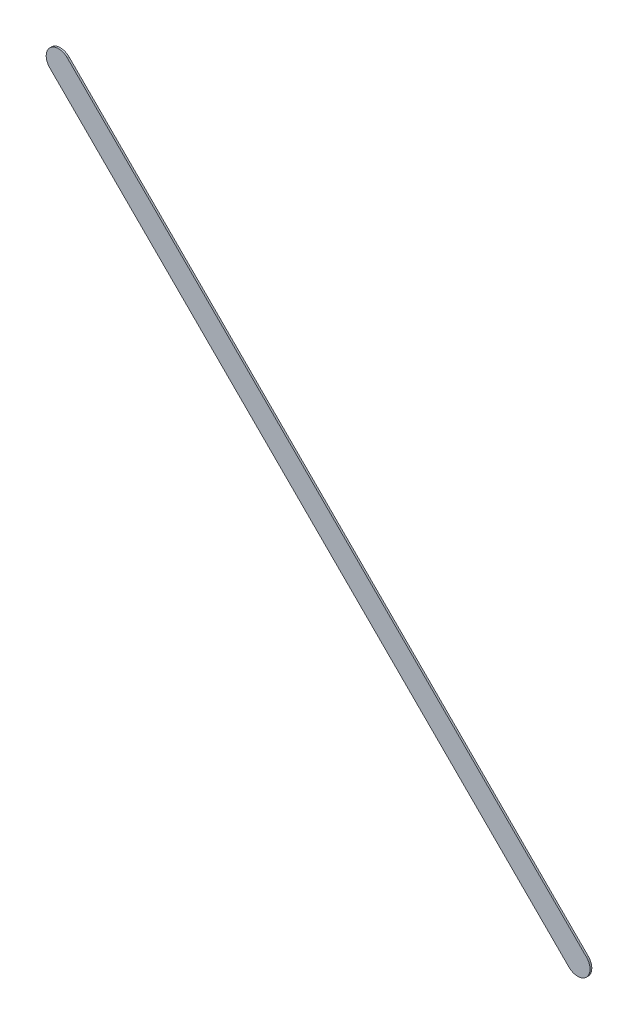
ISO-10303-21;
HEADER;
FILE_DESCRIPTION(('STEP AP214'),'2;1');
FILE_NAME('part.step','',(''),(''),'','','');
FILE_SCHEMA(('AUTOMOTIVE_DESIGN { 1 0 10303 214 1 1 1 1 }'));
ENDSEC;
DATA;
#1=APPLICATION_CONTEXT('core data for automotive mechanical design processes');
#2=APPLICATION_PROTOCOL_DEFINITION('international standard','automotive_design',2000,#1);
#3=PRODUCT_CONTEXT('',#1,'mechanical');
#4=PRODUCT('Part','Part','',(#3));
#5=PRODUCT_RELATED_PRODUCT_CATEGORY('part','',(#4));
#6=PRODUCT_DEFINITION_FORMATION('','',#4);
#7=PRODUCT_DEFINITION_CONTEXT('part definition',#1,'design');
#8=PRODUCT_DEFINITION('design','',#6,#7);
#9=PRODUCT_DEFINITION_SHAPE('','',#8);
#10=(LENGTH_UNIT() NAMED_UNIT(*) SI_UNIT(.MILLI.,.METRE.));
#11=(NAMED_UNIT(*) PLANE_ANGLE_UNIT() SI_UNIT($,.RADIAN.));
#12=(NAMED_UNIT(*) SI_UNIT($,.STERADIAN.) SOLID_ANGLE_UNIT());
#13=UNCERTAINTY_MEASURE_WITH_UNIT(LENGTH_MEASURE(1.E-05),#10,'distance_accuracy_value','');
#14=(GEOMETRIC_REPRESENTATION_CONTEXT(3) GLOBAL_UNCERTAINTY_ASSIGNED_CONTEXT((#13)) GLOBAL_UNIT_ASSIGNED_CONTEXT((#10,
#11,#12)) REPRESENTATION_CONTEXT('',''));
#15=CARTESIAN_POINT('',(0.,0.,0.));
#16=DIRECTION('',(0.,0.,1.));
#17=DIRECTION('',(1.,0.,0.));
#18=AXIS2_PLACEMENT_3D('',#15,#16,#17);
#19=CARTESIAN_POINT('',(100.72322248,77.32322864,0.));
#20=DIRECTION('',(0.707106781186547,0.707106781186548,0.));
#21=DIRECTION('',(0.707106781186548,-0.707106781186547,0.));
#22=AXIS2_PLACEMENT_3D('',#19,#20,#21);
#23=PLANE('',#22);
#24=DIRECTION('',(0.707106781186548,-0.707106781186547,0.));
#25=VECTOR('',#24,1.);
#26=CARTESIAN_POINT('',(100.72322248,77.32322864,0.03556));
#27=LINE('',#26,#25);
#28=CARTESIAN_POINT('',(100.72322248,77.32322864,0.03556));
#29=VERTEX_POINT('',#28);
#30=CARTESIAN_POINT('',(111.22322688,66.82322424,0.03556));
#31=VERTEX_POINT('',#30);
#32=EDGE_CURVE('E11',#29,#31,#27,.T.);
#33=ORIENTED_EDGE('',*,*,#32,.F.);
#34=DIRECTION('',(0.,0.,1.));
#35=VECTOR('',#34,1.);
#36=CARTESIAN_POINT('',(100.72322248,77.32322864,0.));
#37=LINE('',#36,#35);
#38=CARTESIAN_POINT('',(100.72322248,77.32322864,0.));
#39=VERTEX_POINT('',#38);
#40=EDGE_CURVE('E24',#39,#29,#37,.T.);
#41=ORIENTED_EDGE('',*,*,#40,.F.);
#42=DIRECTION('',(0.707106781186548,-0.707106781186547,0.));
#43=VECTOR('',#42,1.);
#44=CARTESIAN_POINT('',(100.72322248,77.32322864,0.));
#45=LINE('',#44,#43);
#46=CARTESIAN_POINT('',(111.22322688,66.82322424,0.));
#47=VERTEX_POINT('',#46);
#48=EDGE_CURVE('E75',#39,#47,#45,.T.);
#49=ORIENTED_EDGE('',*,*,#48,.T.);
#50=DIRECTION('',(0.,0.,1.));
#51=VECTOR('',#50,1.);
#52=CARTESIAN_POINT('',(111.22322688,66.82322424,0.));
#53=LINE('',#52,#51);
#54=EDGE_CURVE('E37',#47,#31,#53,.T.);
#55=ORIENTED_EDGE('',*,*,#54,.T.);
#56=EDGE_LOOP('',(#33,#41,#49,#55));
#57=FACE_BOUND('',#56,.T.);
#58=ADVANCED_FACE('F17',(#57),#23,.F.);
#59=CARTESIAN_POINT('',(111.40000326,67.00000062,0.));
#60=DIRECTION('',(0.,0.,-1.));
#61=DIRECTION('',(-0.707106781186519,-0.707106781186576,0.));
#62=AXIS2_PLACEMENT_3D('',#59,#60,#61);
#63=CYLINDRICAL_SURFACE('',#62,0.249999554103216);
#64=CARTESIAN_POINT('',(111.40000326,67.00000062,0.03556));
#65=DIRECTION('',(0.,0.,1.));
#66=DIRECTION('',(-0.707106781186519,-0.707106781186576,0.));
#67=AXIS2_PLACEMENT_3D('',#64,#65,#66);
#68=CIRCLE('',#67,0.249999554103216);
#69=CARTESIAN_POINT('',(111.57677964,67.176777,0.03556));
#70=VERTEX_POINT('',#69);
#71=EDGE_CURVE('E83',#31,#70,#68,.T.);
#72=ORIENTED_EDGE('',*,*,#71,.F.);
#73=ORIENTED_EDGE('',*,*,#54,.F.);
#74=CARTESIAN_POINT('',(111.40000326,67.00000062,0.));
#75=DIRECTION('',(0.,0.,1.));
#76=DIRECTION('',(-0.707106781186519,-0.707106781186576,0.));
#77=AXIS2_PLACEMENT_3D('',#74,#75,#76);
#78=CIRCLE('',#77,0.249999554103216);
#79=CARTESIAN_POINT('',(111.57677964,67.176777,0.));
#80=VERTEX_POINT('',#79);
#81=EDGE_CURVE('E81',#47,#80,#78,.T.);
#82=ORIENTED_EDGE('',*,*,#81,.T.);
#83=DIRECTION('',(0.,0.,1.));
#84=VECTOR('',#83,1.);
#85=CARTESIAN_POINT('',(111.57677964,67.176777,0.));
#86=LINE('',#85,#84);
#87=EDGE_CURVE('E67',#80,#70,#86,.T.);
#88=ORIENTED_EDGE('',*,*,#87,.T.);
#89=EDGE_LOOP('',(#72,#73,#82,#88));
#90=FACE_BOUND('',#89,.T.);
#91=ADVANCED_FACE('F89',(#90),#63,.T.);
#92=CARTESIAN_POINT('',(111.57677964,67.176777,0.));
#93=DIRECTION('',(-0.707106781186548,-0.707106781186547,0.));
#94=DIRECTION('',(-0.707106781186547,0.707106781186548,0.));
#95=AXIS2_PLACEMENT_3D('',#92,#93,#94);
#96=PLANE('',#95);
#97=DIRECTION('',(-0.707106781186547,0.707106781186548,0.));
#98=VECTOR('',#97,1.);
#99=CARTESIAN_POINT('',(111.57677964,67.176777,0.03556));
#100=LINE('',#99,#98);
#101=CARTESIAN_POINT('',(101.07677524,77.6767814,0.03556));
#102=VERTEX_POINT('',#101);
#103=EDGE_CURVE('E71',#70,#102,#100,.T.);
#104=ORIENTED_EDGE('',*,*,#103,.F.);
#105=ORIENTED_EDGE('',*,*,#87,.F.);
#106=DIRECTION('',(-0.707106781186547,0.707106781186548,0.));
#107=VECTOR('',#106,1.);
#108=CARTESIAN_POINT('',(111.57677964,67.176777,0.));
#109=LINE('',#108,#107);
#110=CARTESIAN_POINT('',(101.07677524,77.6767814,0.));
#111=VERTEX_POINT('',#110);
#112=EDGE_CURVE('E63',#80,#111,#109,.T.);
#113=ORIENTED_EDGE('',*,*,#112,.T.);
#114=DIRECTION('',(0.,0.,1.));
#115=VECTOR('',#114,1.);
#116=CARTESIAN_POINT('',(101.07677524,77.6767814,0.));
#117=LINE('',#116,#115);
#118=EDGE_CURVE('E53',#111,#102,#117,.T.);
#119=ORIENTED_EDGE('',*,*,#118,.T.);
#120=EDGE_LOOP('',(#104,#105,#113,#119));
#121=FACE_BOUND('',#120,.T.);
#122=ADVANCED_FACE('F66',(#121),#96,.F.);
#123=CARTESIAN_POINT('',(100.89999886,77.50000502,0.));
#124=DIRECTION('',(0.,0.,-1.));
#125=DIRECTION('',(0.707106781186576,0.707106781186519,0.));
#126=AXIS2_PLACEMENT_3D('',#123,#124,#125);
#127=CYLINDRICAL_SURFACE('',#126,0.249999554103223);
#128=CARTESIAN_POINT('',(100.89999886,77.50000502,0.03556));
#129=DIRECTION('',(0.,0.,1.));
#130=DIRECTION('',(0.707106781186576,0.707106781186519,0.));
#131=AXIS2_PLACEMENT_3D('',#128,#129,#130);
#132=CIRCLE('',#131,0.249999554103223);
#133=EDGE_CURVE('E59',#102,#29,#132,.T.);
#134=ORIENTED_EDGE('',*,*,#133,.F.);
#135=ORIENTED_EDGE('',*,*,#118,.F.);
#136=CARTESIAN_POINT('',(100.89999886,77.50000502,0.));
#137=DIRECTION('',(0.,0.,1.));
#138=DIRECTION('',(0.707106781186576,0.707106781186519,0.));
#139=AXIS2_PLACEMENT_3D('',#136,#137,#138);
#140=CIRCLE('',#139,0.249999554103223);
#141=EDGE_CURVE('E57',#111,#39,#140,.T.);
#142=ORIENTED_EDGE('',*,*,#141,.T.);
#143=ORIENTED_EDGE('',*,*,#40,.T.);
#144=EDGE_LOOP('',(#134,#135,#142,#143));
#145=FACE_BOUND('',#144,.T.);
#146=ADVANCED_FACE('F55',(#145),#127,.T.);
#147=CARTESIAN_POINT('',(100.72322248,77.32322864,0.));
#148=DIRECTION('',(0.,0.,-1.));
#149=DIRECTION('',(-1.,0.,0.));
#150=AXIS2_PLACEMENT_3D('',#147,#148,#149);
#151=PLANE('',#150);
#152=ORIENTED_EDGE('',*,*,#141,.F.);
#153=ORIENTED_EDGE('',*,*,#112,.F.);
#154=ORIENTED_EDGE('',*,*,#81,.F.);
#155=ORIENTED_EDGE('',*,*,#48,.F.);
#156=EDGE_LOOP('',(#152,#153,#154,#155));
#157=FACE_BOUND('',#156,.T.);
#158=ADVANCED_FACE('F74',(#157),#151,.T.);
#159=CARTESIAN_POINT('',(100.72322248,77.32322864,0.03556));
#160=DIRECTION('',(0.,0.,-1.));
#161=DIRECTION('',(-1.,0.,0.));
#162=AXIS2_PLACEMENT_3D('',#159,#160,#161);
#163=PLANE('',#162);
#164=ORIENTED_EDGE('',*,*,#32,.T.);
#165=ORIENTED_EDGE('',*,*,#71,.T.);
#166=ORIENTED_EDGE('',*,*,#103,.T.);
#167=ORIENTED_EDGE('',*,*,#133,.T.);
#168=EDGE_LOOP('',(#164,#165,#166,#167));
#169=FACE_BOUND('',#168,.T.);
#170=ADVANCED_FACE('F91',(#169),#163,.F.);
#171=CLOSED_SHELL('',(#58,#91,#122,#146,#158,#170));
#172=MANIFOLD_SOLID_BREP('B1',#171);
#173=ADVANCED_BREP_SHAPE_REPRESENTATION('',(#18,#172),#14);
#174=SHAPE_DEFINITION_REPRESENTATION(#9,#173);
ENDSEC;
END-ISO-10303-21;
